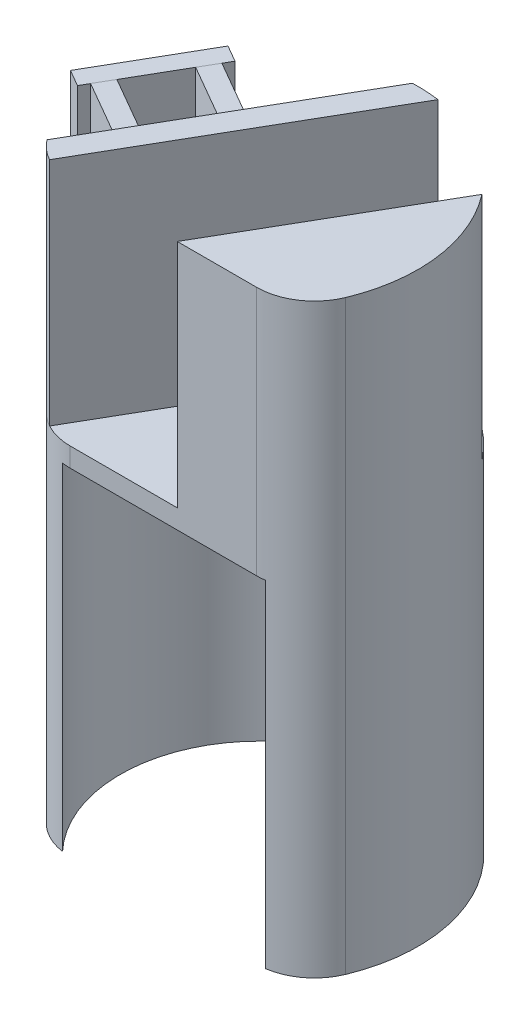
ISO-10303-21;
HEADER;
FILE_DESCRIPTION(('STEP AP214'),'2;1');
FILE_NAME('part.step','',(''),(''),'','','');
FILE_SCHEMA(('AUTOMOTIVE_DESIGN { 1 0 10303 214 1 1 1 1 }'));
ENDSEC;
DATA;
#1=APPLICATION_CONTEXT('core data for automotive mechanical design processes');
#2=APPLICATION_PROTOCOL_DEFINITION('international standard','automotive_design',2000,#1);
#3=PRODUCT_CONTEXT('',#1,'mechanical');
#4=PRODUCT('Part','Part','',(#3));
#5=PRODUCT_RELATED_PRODUCT_CATEGORY('part','',(#4));
#6=PRODUCT_DEFINITION_FORMATION('','',#4);
#7=PRODUCT_DEFINITION_CONTEXT('part definition',#1,'design');
#8=PRODUCT_DEFINITION('design','',#6,#7);
#9=PRODUCT_DEFINITION_SHAPE('','',#8);
#10=(LENGTH_UNIT() NAMED_UNIT(*) SI_UNIT(.MILLI.,.METRE.));
#11=(NAMED_UNIT(*) PLANE_ANGLE_UNIT() SI_UNIT($,.RADIAN.));
#12=(NAMED_UNIT(*) SI_UNIT($,.STERADIAN.) SOLID_ANGLE_UNIT());
#13=UNCERTAINTY_MEASURE_WITH_UNIT(LENGTH_MEASURE(1.E-05),#10,'distance_accuracy_value','');
#14=(GEOMETRIC_REPRESENTATION_CONTEXT(3) GLOBAL_UNCERTAINTY_ASSIGNED_CONTEXT((#13)) GLOBAL_UNIT_ASSIGNED_CONTEXT((#10,
#11,#12)) REPRESENTATION_CONTEXT('',''));
#15=CARTESIAN_POINT('',(0.,0.,0.));
#16=DIRECTION('',(0.,0.,1.));
#17=DIRECTION('',(1.,0.,0.));
#18=AXIS2_PLACEMENT_3D('',#15,#16,#17);
#19=CARTESIAN_POINT('',(-16.1590211270711,58.142616215477,-9.51175440733389));
#20=DIRECTION('',(0.500000000000004,0.,-0.866025403784436));
#21=DIRECTION('',(-0.866025403784436,0.,-0.500000000000004));
#22=AXIS2_PLACEMENT_3D('',#19,#20,#21);
#23=PLANE('',#22);
#24=DIRECTION('',(0.,1.,0.));
#25=VECTOR('',#24,1.);
#26=CARTESIAN_POINT('',(-12.4776684857521,0.,-7.38632446888636));
#27=LINE('',#26,#25);
#28=CARTESIAN_POINT('',(-12.4776684857521,35.,-7.38632446888637));
#29=VERTEX_POINT('',#28);
#30=CARTESIAN_POINT('',(-12.4776684857521,27.,-7.38632446888637));
#31=VERTEX_POINT('',#30);
#32=EDGE_CURVE('E118',#29,#31,#27,.F.);
#33=ORIENTED_EDGE('',*,*,#32,.F.);
#34=DIRECTION('',(-0.866025403784436,0.,-0.500000000000004));
#35=VECTOR('',#34,1.);
#36=CARTESIAN_POINT('',(-16.1590211270711,35.,-9.51175440733389));
#37=LINE('',#36,#35);
#38=CARTESIAN_POINT('',(-7.49876708922678,35.,-4.51175440733385));
#39=VERTEX_POINT('',#38);
#40=EDGE_CURVE('E107',#39,#29,#37,.T.);
#41=ORIENTED_EDGE('',*,*,#40,.F.);
#42=DIRECTION('',(0.,1.,0.));
#43=VECTOR('',#42,1.);
#44=CARTESIAN_POINT('',(-7.49876708922677,58.142616215477,-4.51175440733385));
#45=LINE('',#44,#43);
#46=CARTESIAN_POINT('',(-7.49876708922677,58.142616215477,-4.51175440733385));
#47=VERTEX_POINT('',#46);
#48=EDGE_CURVE('E125',#39,#47,#45,.T.);
#49=ORIENTED_EDGE('',*,*,#48,.T.);
#50=DIRECTION('',(0.866025403784436,0.,0.500000000000004));
#51=VECTOR('',#50,1.);
#52=CARTESIAN_POINT('',(-16.1590211270711,58.142616215477,-9.51175440733389));
#53=LINE('',#52,#51);
#54=CARTESIAN_POINT('',(-16.1590211270711,58.142616215477,-9.51175440733389));
#55=VERTEX_POINT('',#54);
#56=EDGE_CURVE('E146',#55,#47,#53,.T.);
#57=ORIENTED_EDGE('',*,*,#56,.F.);
#58=DIRECTION('',(0.,1.,0.));
#59=VECTOR('',#58,1.);
#60=CARTESIAN_POINT('',(-16.1590211270711,58.142616215477,-9.51175440733389));
#61=LINE('',#60,#59);
#62=CARTESIAN_POINT('',(-16.1590211270711,27.,-9.51175440733389));
#63=VERTEX_POINT('',#62);
#64=EDGE_CURVE('E130',#63,#55,#61,.T.);
#65=ORIENTED_EDGE('',*,*,#64,.F.);
#66=DIRECTION('',(0.866025403784436,0.,0.500000000000004));
#67=VECTOR('',#66,1.);
#68=CARTESIAN_POINT('',(-16.1590211270711,27.,-9.51175440733389));
#69=LINE('',#68,#67);
#70=EDGE_CURVE('E124',#63,#31,#69,.T.);
#71=ORIENTED_EDGE('',*,*,#70,.T.);
#72=EDGE_LOOP('',(#33,#41,#49,#57,#65,#71));
#73=FACE_BOUND('',#72,.T.);
#74=ADVANCED_FACE('F49',(#73),#23,.F.);
#75=CARTESIAN_POINT('',(-15.1590211270711,58.142616215477,-11.2438052149028));
#76=DIRECTION('',(-0.500000000000004,0.,0.866025403784436));
#77=DIRECTION('',(0.866025403784436,0.,0.500000000000004));
#78=AXIS2_PLACEMENT_3D('',#75,#76,#77);
#79=PLANE('',#78);
#80=DIRECTION('',(0.,1.,0.));
#81=VECTOR('',#80,1.);
#82=CARTESIAN_POINT('',(-11.3385754410158,0.,-9.03806986963436));
#83=LINE('',#82,#81);
#84=CARTESIAN_POINT('',(-11.3385754410158,27.,-9.03806986963436));
#85=VERTEX_POINT('',#84);
#86=CARTESIAN_POINT('',(-11.3385754410158,35.,-9.03806986963437));
#87=VERTEX_POINT('',#86);
#88=EDGE_CURVE('E114',#85,#87,#83,.T.);
#89=ORIENTED_EDGE('',*,*,#88,.F.);
#90=DIRECTION('',(0.866025403784436,0.,0.500000000000004));
#91=VECTOR('',#90,1.);
#92=CARTESIAN_POINT('',(-15.1590211270711,27.,-11.2438052149028));
#93=LINE('',#92,#91);
#94=CARTESIAN_POINT('',(-15.1590211270711,27.,-11.2438052149028));
#95=VERTEX_POINT('',#94);
#96=EDGE_CURVE('E141',#95,#85,#93,.T.);
#97=ORIENTED_EDGE('',*,*,#96,.F.);
#98=DIRECTION('',(0.,-1.,0.));
#99=VECTOR('',#98,1.);
#100=CARTESIAN_POINT('',(-15.1590211270711,58.142616215477,-11.2438052149028));
#101=LINE('',#100,#99);
#102=CARTESIAN_POINT('',(-15.1590211270711,58.142616215477,-11.2438052149028));
#103=VERTEX_POINT('',#102);
#104=EDGE_CURVE('E134',#103,#95,#101,.T.);
#105=ORIENTED_EDGE('',*,*,#104,.F.);
#106=DIRECTION('',(0.866025403784436,0.,0.500000000000004));
#107=VECTOR('',#106,1.);
#108=CARTESIAN_POINT('',(-15.1590211270711,58.142616215477,-11.2438052149028));
#109=LINE('',#108,#107);
#110=CARTESIAN_POINT('',(-6.49876708922677,58.142616215477,-6.24380521490272));
#111=VERTEX_POINT('',#110);
#112=EDGE_CURVE('E144',#103,#111,#109,.T.);
#113=ORIENTED_EDGE('',*,*,#112,.T.);
#114=DIRECTION('',(0.,-1.,0.));
#115=VECTOR('',#114,1.);
#116=CARTESIAN_POINT('',(-6.49876708922677,58.142616215477,-6.24380521490272));
#117=LINE('',#116,#115);
#118=CARTESIAN_POINT('',(-6.49876708922677,35.,-6.24380521490272));
#119=VERTEX_POINT('',#118);
#120=EDGE_CURVE('E132',#111,#119,#117,.T.);
#121=ORIENTED_EDGE('',*,*,#120,.T.);
#122=DIRECTION('',(0.866025403784436,0.,0.500000000000004));
#123=VECTOR('',#122,1.);
#124=CARTESIAN_POINT('',(-15.1590211270711,35.,-11.2438052149028));
#125=LINE('',#124,#123);
#126=EDGE_CURVE('E63',#87,#119,#125,.T.);
#127=ORIENTED_EDGE('',*,*,#126,.F.);
#128=EDGE_LOOP('',(#89,#97,#105,#113,#121,#127));
#129=FACE_BOUND('',#128,.T.);
#130=ADVANCED_FACE('F153',(#129),#79,.F.);
#131=CARTESIAN_POINT('',(-7.57772228311382,0.,-4.37500000000004));
#132=DIRECTION('',(-0.866025403784436,0.,-0.500000000000004));
#133=DIRECTION('',(-0.500000000000004,0.,0.866025403784436));
#134=AXIS2_PLACEMENT_3D('',#131,#132,#133);
#135=PLANE('',#134);
#136=DIRECTION('',(-0.500000000000004,0.,0.866025403784436));
#137=VECTOR('',#136,1.);
#138=CARTESIAN_POINT('',(-7.57772228311382,35.,-4.37500000000004));
#139=LINE('',#138,#137);
#140=EDGE_CURVE('E56',#119,#39,#139,.T.);
#141=ORIENTED_EDGE('',*,*,#140,.F.);
#142=ORIENTED_EDGE('',*,*,#120,.F.);
#143=DIRECTION('',(0.500000000000004,0.,-0.866025403784436));
#144=VECTOR('',#143,1.);
#145=CARTESIAN_POINT('',(-6.49876708922677,58.142616215477,-6.24380521490272));
#146=LINE('',#145,#144);
#147=EDGE_CURVE('E88',#47,#111,#146,.T.);
#148=ORIENTED_EDGE('',*,*,#147,.F.);
#149=ORIENTED_EDGE('',*,*,#48,.F.);
#150=EDGE_LOOP('',(#141,#142,#148,#149));
#151=FACE_BOUND('',#150,.T.);
#152=ADVANCED_FACE('F151',(#151),#135,.F.);
#153=CARTESIAN_POINT('',(-15.1590211270711,58.142616215477,-11.2438052149028));
#154=DIRECTION('',(0.,-1.,0.));
#155=DIRECTION('',(0.,0.,-1.));
#156=AXIS2_PLACEMENT_3D('',#153,#154,#155);
#157=PLANE('',#156);
#158=ORIENTED_EDGE('',*,*,#147,.T.);
#159=ORIENTED_EDGE('',*,*,#112,.F.);
#160=DIRECTION('',(0.500000000000004,0.,-0.866025403784436));
#161=VECTOR('',#160,1.);
#162=CARTESIAN_POINT('',(-15.1590211270711,58.142616215477,-11.2438052149028));
#163=LINE('',#162,#161);
#164=EDGE_CURVE('E93',#55,#103,#163,.T.);
#165=ORIENTED_EDGE('',*,*,#164,.F.);
#166=ORIENTED_EDGE('',*,*,#56,.T.);
#167=EDGE_LOOP('',(#158,#159,#165,#166));
#168=FACE_BOUND('',#167,.T.);
#169=ADVANCED_FACE('F148',(#168),#157,.F.);
#170=CARTESIAN_POINT('',(-15.1590211270711,27.,-11.2438052149028));
#171=DIRECTION('',(0.,1.,0.));
#172=DIRECTION('',(0.,0.,1.));
#173=AXIS2_PLACEMENT_3D('',#170,#171,#172);
#174=PLANE('',#173);
#175=CARTESIAN_POINT('',(0.,27.,0.));
#176=DIRECTION('',(0.,1.,0.));
#177=DIRECTION('',(0.,0.,1.));
#178=AXIS2_PLACEMENT_3D('',#175,#176,#177);
#179=CIRCLE('',#178,14.5);
#180=EDGE_CURVE('E12',#31,#85,#179,.F.);
#181=ORIENTED_EDGE('',*,*,#180,.F.);
#182=ORIENTED_EDGE('',*,*,#70,.F.);
#183=DIRECTION('',(-0.500000000000004,0.,0.866025403784436));
#184=VECTOR('',#183,1.);
#185=CARTESIAN_POINT('',(-15.1590211270711,27.,-11.2438052149028));
#186=LINE('',#185,#184);
#187=EDGE_CURVE('E72',#95,#63,#186,.T.);
#188=ORIENTED_EDGE('',*,*,#187,.F.);
#189=ORIENTED_EDGE('',*,*,#96,.T.);
#190=EDGE_LOOP('',(#181,#182,#188,#189));
#191=FACE_BOUND('',#190,.T.);
#192=ADVANCED_FACE('F158',(#191),#174,.F.);
#193=CARTESIAN_POINT('',(-16.2379763209582,0.,-9.37500000000008));
#194=DIRECTION('',(-0.866025403784436,0.,-0.500000000000004));
#195=DIRECTION('',(-0.500000000000004,0.,0.866025403784436));
#196=AXIS2_PLACEMENT_3D('',#193,#194,#195);
#197=PLANE('',#196);
#198=ORIENTED_EDGE('',*,*,#64,.T.);
#199=ORIENTED_EDGE('',*,*,#164,.T.);
#200=ORIENTED_EDGE('',*,*,#104,.T.);
#201=ORIENTED_EDGE('',*,*,#187,.T.);
#202=EDGE_LOOP('',(#198,#199,#200,#201));
#203=FACE_BOUND('',#202,.T.);
#204=ADVANCED_FACE('F156',(#203),#197,.T.);
#205=CARTESIAN_POINT('',(0.,0.,0.));
#206=DIRECTION('',(0.,1.,0.));
#207=DIRECTION('',(0.,0.,1.));
#208=AXIS2_PLACEMENT_3D('',#205,#206,#207);
#209=CYLINDRICAL_SURFACE('',#208,14.5);
#210=ORIENTED_EDGE('',*,*,#32,.T.);
#211=ORIENTED_EDGE('',*,*,#180,.T.);
#212=ORIENTED_EDGE('',*,*,#88,.T.);
#213=CARTESIAN_POINT('',(0.,35.,0.));
#214=DIRECTION('',(0.,-1.,0.));
#215=DIRECTION('',(0.,0.,-1.));
#216=AXIS2_PLACEMENT_3D('',#213,#214,#215);
#217=CIRCLE('',#216,14.5);
#218=EDGE_CURVE('E110',#29,#87,#217,.T.);
#219=ORIENTED_EDGE('',*,*,#218,.F.);
#220=EDGE_LOOP('',(#210,#211,#212,#219));
#221=FACE_BOUND('',#220,.T.);
#222=ADVANCED_FACE('F117',(#221),#209,.F.);
#223=CARTESIAN_POINT('',(9.7082439194738,35.,4.));
#224=DIRECTION('',(0.,-1.,0.));
#225=DIRECTION('',(0.,0.,-1.));
#226=AXIS2_PLACEMENT_3D('',#223,#224,#225);
#227=PLANE('',#226);
#228=ORIENTED_EDGE('',*,*,#40,.T.);
#229=ORIENTED_EDGE('',*,*,#218,.T.);
#230=ORIENTED_EDGE('',*,*,#126,.T.);
#231=ORIENTED_EDGE('',*,*,#140,.T.);
#232=EDGE_LOOP('',(#228,#229,#230,#231));
#233=FACE_BOUND('',#232,.T.);
#234=ADVANCED_FACE('F109',(#233),#227,.T.);
#235=CLOSED_SHELL('',(#74,#130,#152,#169,#192,#204,#222,#234));
#236=MANIFOLD_SOLID_BREP('B2',#235);
#237=CARTESIAN_POINT('',(-20.1590211270712,58.142616215477,-2.5835511770584));
#238=DIRECTION('',(0.500000000000004,0.,-0.866025403784436));
#239=DIRECTION('',(-0.866025403784436,0.,-0.500000000000004));
#240=AXIS2_PLACEMENT_3D('',#237,#238,#239);
#241=PLANE('',#240);
#242=DIRECTION('',(0.,1.,0.));
#243=VECTOR('',#242,1.);
#244=CARTESIAN_POINT('',(-14.4834177821711,0.,0.693259941933222));
#245=LINE('',#244,#243);
#246=CARTESIAN_POINT('',(-14.4834177821711,35.,0.693259941933225));
#247=VERTEX_POINT('',#246);
#248=CARTESIAN_POINT('',(-14.4834177821711,27.,0.693259941933221));
#249=VERTEX_POINT('',#248);
#250=EDGE_CURVE('E327',#247,#249,#245,.F.);
#251=ORIENTED_EDGE('',*,*,#250,.F.);
#252=DIRECTION('',(-0.866025403784436,0.,-0.500000000000004));
#253=VECTOR('',#252,1.);
#254=CARTESIAN_POINT('',(-20.1590211270712,35.,-2.5835511770584));
#255=LINE('',#254,#253);
#256=CARTESIAN_POINT('',(-11.4987670892268,35.,2.41644882294164));
#257=VERTEX_POINT('',#256);
#258=EDGE_CURVE('E316',#257,#247,#255,.T.);
#259=ORIENTED_EDGE('',*,*,#258,.F.);
#260=DIRECTION('',(0.,1.,0.));
#261=VECTOR('',#260,1.);
#262=CARTESIAN_POINT('',(-11.4987670892268,58.142616215477,2.41644882294164));
#263=LINE('',#262,#261);
#264=CARTESIAN_POINT('',(-11.4987670892268,58.142616215477,2.41644882294164));
#265=VERTEX_POINT('',#264);
#266=EDGE_CURVE('E366',#257,#265,#263,.T.);
#267=ORIENTED_EDGE('',*,*,#266,.T.);
#268=DIRECTION('',(0.866025403784436,0.,0.500000000000004));
#269=VECTOR('',#268,1.);
#270=CARTESIAN_POINT('',(-20.1590211270712,58.142616215477,-2.5835511770584));
#271=LINE('',#270,#269);
#272=CARTESIAN_POINT('',(-20.1590211270712,58.142616215477,-2.5835511770584));
#273=VERTEX_POINT('',#272);
#274=EDGE_CURVE('E391',#273,#265,#271,.T.);
#275=ORIENTED_EDGE('',*,*,#274,.F.);
#276=DIRECTION('',(0.,1.,0.));
#277=VECTOR('',#276,1.);
#278=CARTESIAN_POINT('',(-20.1590211270712,58.142616215477,-2.5835511770584));
#279=LINE('',#278,#277);
#280=CARTESIAN_POINT('',(-20.1590211270712,58.1383875561259,-2.5835511770584));
#281=VERTEX_POINT('',#280);
#282=EDGE_CURVE('E370',#281,#273,#279,.T.);
#283=ORIENTED_EDGE('',*,*,#282,.F.);
#284=CARTESIAN_POINT('',(-20.1590211270712,27.,-2.58355117705839));
#285=VERTEX_POINT('',#284);
#286=EDGE_CURVE('E367',#285,#281,#279,.T.);
#287=ORIENTED_EDGE('',*,*,#286,.F.);
#288=DIRECTION('',(0.866025403784436,0.,0.500000000000004));
#289=VECTOR('',#288,1.);
#290=CARTESIAN_POINT('',(-20.1590211270712,27.,-2.5835511770584));
#291=LINE('',#290,#289);
#292=EDGE_CURVE('E334',#285,#249,#291,.T.);
#293=ORIENTED_EDGE('',*,*,#292,.T.);
#294=EDGE_LOOP('',(#251,#259,#267,#275,#283,#287,#293));
#295=FACE_BOUND('',#294,.T.);
#296=ADVANCED_FACE('F234',(#295),#241,.F.);
#297=CARTESIAN_POINT('',(-19.1590211270712,58.142616215477,-4.31560198462727));
#298=DIRECTION('',(-0.500000000000004,0.,0.866025403784436));
#299=DIRECTION('',(0.866025403784436,0.,0.500000000000004));
#300=AXIS2_PLACEMENT_3D('',#297,#298,#299);
#301=PLANE('',#300);
#302=DIRECTION('',(0.,1.,0.));
#303=VECTOR('',#302,1.);
#304=CARTESIAN_POINT('',(-14.414085818919,0.,-1.57611230717822));
#305=LINE('',#304,#303);
#306=CARTESIAN_POINT('',(-14.414085818919,27.,-1.57611230717822));
#307=VERTEX_POINT('',#306);
#308=CARTESIAN_POINT('',(-14.414085818919,35.,-1.57611230717822));
#309=VERTEX_POINT('',#308);
#310=EDGE_CURVE('E323',#307,#309,#305,.T.);
#311=ORIENTED_EDGE('',*,*,#310,.F.);
#312=DIRECTION('',(0.866025403784436,0.,0.500000000000004));
#313=VECTOR('',#312,1.);
#314=CARTESIAN_POINT('',(-19.1590211270712,27.,-4.31560198462727));
#315=LINE('',#314,#313);
#316=CARTESIAN_POINT('',(-19.1590211270712,27.,-4.31560198462727));
#317=VERTEX_POINT('',#316);
#318=EDGE_CURVE('E385',#317,#307,#315,.T.);
#319=ORIENTED_EDGE('',*,*,#318,.F.);
#320=DIRECTION('',(0.,-1.,0.));
#321=VECTOR('',#320,1.);
#322=CARTESIAN_POINT('',(-19.1590211270712,58.142616215477,-4.31560198462727));
#323=LINE('',#322,#321);
#324=CARTESIAN_POINT('',(-19.1590211270712,58.1391564032806,-4.31560198462727));
#325=VERTEX_POINT('',#324);
#326=EDGE_CURVE('E372',#325,#317,#323,.T.);
#327=ORIENTED_EDGE('',*,*,#326,.F.);
#328=CARTESIAN_POINT('',(-19.1590211270712,58.142616215477,-4.31560198462727));
#329=VERTEX_POINT('',#328);
#330=EDGE_CURVE('E373',#329,#325,#323,.T.);
#331=ORIENTED_EDGE('',*,*,#330,.F.);
#332=DIRECTION('',(0.866025403784436,0.,0.500000000000004));
#333=VECTOR('',#332,1.);
#334=CARTESIAN_POINT('',(-19.1590211270712,58.142616215477,-4.31560198462727));
#335=LINE('',#334,#333);
#336=CARTESIAN_POINT('',(-10.4987670892268,58.142616215477,0.684398015372769));
#337=VERTEX_POINT('',#336);
#338=EDGE_CURVE('E388',#329,#337,#335,.T.);
#339=ORIENTED_EDGE('',*,*,#338,.T.);
#340=DIRECTION('',(0.,-1.,0.));
#341=VECTOR('',#340,1.);
#342=CARTESIAN_POINT('',(-10.4987670892268,58.142616215477,0.684398015372769));
#343=LINE('',#342,#341);
#344=CARTESIAN_POINT('',(-10.4987670892268,35.,0.684398015372771));
#345=VERTEX_POINT('',#344);
#346=EDGE_CURVE('E381',#337,#345,#343,.T.);
#347=ORIENTED_EDGE('',*,*,#346,.T.);
#348=DIRECTION('',(0.866025403784436,0.,0.500000000000004));
#349=VECTOR('',#348,1.);
#350=CARTESIAN_POINT('',(-19.1590211270712,35.,-4.31560198462727));
#351=LINE('',#350,#349);
#352=EDGE_CURVE('E248',#309,#345,#351,.T.);
#353=ORIENTED_EDGE('',*,*,#352,.F.);
#354=EDGE_LOOP('',(#311,#319,#327,#331,#339,#347,#353));
#355=FACE_BOUND('',#354,.T.);
#356=ADVANCED_FACE('F409',(#355),#301,.F.);
#357=CARTESIAN_POINT('',(-7.57772228311382,0.,-4.37500000000004));
#358=DIRECTION('',(-0.866025403784436,0.,-0.500000000000004));
#359=DIRECTION('',(-0.500000000000004,0.,0.866025403784436));
#360=AXIS2_PLACEMENT_3D('',#357,#358,#359);
#361=PLANE('',#360);
#362=DIRECTION('',(-0.500000000000004,0.,0.866025403784436));
#363=VECTOR('',#362,1.);
#364=CARTESIAN_POINT('',(-7.57772228311382,35.,-4.37500000000004));
#365=LINE('',#364,#363);
#366=EDGE_CURVE('E241',#345,#257,#365,.T.);
#367=ORIENTED_EDGE('',*,*,#366,.F.);
#368=ORIENTED_EDGE('',*,*,#346,.F.);
#369=DIRECTION('',(0.500000000000004,0.,-0.866025403784436));
#370=VECTOR('',#369,1.);
#371=CARTESIAN_POINT('',(-10.4987670892268,58.142616215477,0.684398015372769));
#372=LINE('',#371,#370);
#373=EDGE_CURVE('E379',#265,#337,#372,.T.);
#374=ORIENTED_EDGE('',*,*,#373,.F.);
#375=ORIENTED_EDGE('',*,*,#266,.F.);
#376=EDGE_LOOP('',(#367,#368,#374,#375));
#377=FACE_BOUND('',#376,.T.);
#378=ADVANCED_FACE('F446',(#377),#361,.F.);
#379=CARTESIAN_POINT('',(-16.2379763209582,0.,-9.37500000000008));
#380=DIRECTION('',(-0.866025403784436,0.,-0.500000000000004));
#381=DIRECTION('',(-0.500000000000004,0.,0.866025403784436));
#382=AXIS2_PLACEMENT_3D('',#379,#380,#381);
#383=PLANE('',#382);
#384=ORIENTED_EDGE('',*,*,#330,.T.);
#385=DIRECTION('',(-0.499999963054636,-0.000384423548971222,0.866025339793183));
#386=VECTOR('',#385,1.);
#387=CARTESIAN_POINT('',(-16.2491517822281,58.1413936480471,-9.35564353328256));
#388=LINE('',#387,#386);
#389=EDGE_CURVE('E394',#325,#281,#388,.T.);
#390=ORIENTED_EDGE('',*,*,#389,.T.);
#391=ORIENTED_EDGE('',*,*,#282,.T.);
#392=DIRECTION('',(0.500000000000004,0.,-0.866025403784436));
#393=VECTOR('',#392,1.);
#394=CARTESIAN_POINT('',(-19.1590211270712,58.142616215477,-4.31560198462727));
#395=LINE('',#394,#393);
#396=EDGE_CURVE('E369',#273,#329,#395,.T.);
#397=ORIENTED_EDGE('',*,*,#396,.T.);
#398=EDGE_LOOP('',(#384,#390,#391,#397));
#399=FACE_BOUND('',#398,.T.);
#400=ADVANCED_FACE('F398',(#399),#383,.T.);
#401=CARTESIAN_POINT('',(-19.1590211270712,58.142616215477,-4.31560198462727));
#402=DIRECTION('',(0.,-1.,0.));
#403=DIRECTION('',(0.,0.,-1.));
#404=AXIS2_PLACEMENT_3D('',#401,#402,#403);
#405=PLANE('',#404);
#406=ORIENTED_EDGE('',*,*,#373,.T.);
#407=ORIENTED_EDGE('',*,*,#338,.F.);
#408=ORIENTED_EDGE('',*,*,#396,.F.);
#409=ORIENTED_EDGE('',*,*,#274,.T.);
#410=EDGE_LOOP('',(#406,#407,#408,#409));
#411=FACE_BOUND('',#410,.T.);
#412=ADVANCED_FACE('F405',(#411),#405,.F.);
#413=CARTESIAN_POINT('',(-19.1590211270712,27.,-4.31560198462727));
#414=DIRECTION('',(0.,1.,0.));
#415=DIRECTION('',(0.,0.,1.));
#416=AXIS2_PLACEMENT_3D('',#413,#414,#415);
#417=PLANE('',#416);
#418=CARTESIAN_POINT('',(0.,27.,0.));
#419=DIRECTION('',(0.,1.,0.));
#420=DIRECTION('',(0.,0.,1.));
#421=AXIS2_PLACEMENT_3D('',#418,#419,#420);
#422=CIRCLE('',#421,14.5);
#423=EDGE_CURVE('E47',#249,#307,#422,.F.);
#424=ORIENTED_EDGE('',*,*,#423,.F.);
#425=ORIENTED_EDGE('',*,*,#292,.F.);
#426=DIRECTION('',(-0.500000000000004,0.,0.866025403784436));
#427=VECTOR('',#426,1.);
#428=CARTESIAN_POINT('',(-19.1590211270712,27.,-4.31560198462727));
#429=LINE('',#428,#427);
#430=EDGE_CURVE('E376',#317,#285,#429,.T.);
#431=ORIENTED_EDGE('',*,*,#430,.F.);
#432=ORIENTED_EDGE('',*,*,#318,.T.);
#433=EDGE_LOOP('',(#424,#425,#431,#432));
#434=FACE_BOUND('',#433,.T.);
#435=ADVANCED_FACE('F454',(#434),#417,.F.);
#436=CARTESIAN_POINT('',(-16.2379763209582,0.,-9.37500000000008));
#437=DIRECTION('',(0.866025403784436,0.,0.500000000000004));
#438=DIRECTION('',(0.500000000000004,0.,-0.866025403784436));
#439=AXIS2_PLACEMENT_3D('',#436,#437,#438);
#440=PLANE('',#439);
#441=ORIENTED_EDGE('',*,*,#286,.T.);
#442=DIRECTION('',(0.499999963054637,0.000384423548971222,-0.866025339793183));
#443=VECTOR('',#442,1.);
#444=CARTESIAN_POINT('',(-14.6590211270711,58.142616215477,-12.1098306186872));
#445=LINE('',#444,#443);
#446=CARTESIAN_POINT('',(-20.6590211270712,58.1380031325485,-1.71752577327397));
#447=VERTEX_POINT('',#446);
#448=EDGE_CURVE('E256',#447,#281,#445,.T.);
#449=ORIENTED_EDGE('',*,*,#448,.F.);
#450=DIRECTION('',(0.,1.,0.));
#451=VECTOR('',#450,1.);
#452=CARTESIAN_POINT('',(-20.6590211270712,58.1380031325485,-1.71752577327397));
#453=LINE('',#452,#451);
#454=CARTESIAN_POINT('',(-20.6590211270712,26.9953869170715,-1.71752577327397));
#455=VERTEX_POINT('',#454);
#456=EDGE_CURVE('E344',#455,#447,#453,.T.);
#457=ORIENTED_EDGE('',*,*,#456,.F.);
#458=DIRECTION('',(-0.499999963054637,-0.000384423548971222,0.866025339793182));
#459=VECTOR('',#458,1.);
#460=CARTESIAN_POINT('',(-14.6590211270711,27.,-12.1098306186872));
#461=LINE('',#460,#459);
#462=CARTESIAN_POINT('',(-14.6590211270711,27.,-12.1098306186872));
#463=VERTEX_POINT('',#462);
#464=EDGE_CURVE('E353',#463,#455,#461,.T.);
#465=ORIENTED_EDGE('',*,*,#464,.F.);
#466=DIRECTION('',(0.,-1.,0.));
#467=VECTOR('',#466,1.);
#468=CARTESIAN_POINT('',(-14.6590211270711,58.142616215477,-12.1098306186872));
#469=LINE('',#468,#467);
#470=CARTESIAN_POINT('',(-14.6590211270711,58.142616215477,-12.1098306186872));
#471=VERTEX_POINT('',#470);
#472=EDGE_CURVE('E351',#471,#463,#469,.T.);
#473=ORIENTED_EDGE('',*,*,#472,.F.);
#474=EDGE_CURVE('E335',#325,#471,#445,.T.);
#475=ORIENTED_EDGE('',*,*,#474,.F.);
#476=ORIENTED_EDGE('',*,*,#326,.T.);
#477=ORIENTED_EDGE('',*,*,#430,.T.);
#478=EDGE_LOOP('',(#441,#449,#457,#465,#473,#475,#476,#477));
#479=FACE_BOUND('',#478,.T.);
#480=ADVANCED_FACE('F413',(#479),#440,.T.);
#481=CARTESIAN_POINT('',(-16.39107193464,58.142616215477,-13.1098306186872));
#482=DIRECTION('',(0.000192211774485619,-0.999999926109265,-0.000332920559222045));
#483=DIRECTION('',(0.,0.000332920565371981,-0.999999944581947));
#484=AXIS2_PLACEMENT_3D('',#481,#482,#483);
#485=PLANE('',#484);
#486=ORIENTED_EDGE('',*,*,#448,.T.);
#487=ORIENTED_EDGE('',*,*,#389,.F.);
#488=ORIENTED_EDGE('',*,*,#474,.T.);
#489=DIRECTION('',(0.866025403784436,0.,0.500000000000004));
#490=VECTOR('',#489,1.);
#491=CARTESIAN_POINT('',(-16.39107193464,58.142616215477,-13.1098306186872));
#492=LINE('',#491,#490);
#493=CARTESIAN_POINT('',(-16.39107193464,58.142616215477,-13.1098306186872));
#494=VERTEX_POINT('',#493);
#495=EDGE_CURVE('E363',#494,#471,#492,.T.);
#496=ORIENTED_EDGE('',*,*,#495,.F.);
#497=DIRECTION('',(0.499999963054637,0.000384423548971222,-0.866025339793183));
#498=VECTOR('',#497,1.);
#499=CARTESIAN_POINT('',(-16.39107193464,58.142616215477,-13.1098306186872));
#500=LINE('',#499,#498);
#501=CARTESIAN_POINT('',(-22.3910719346401,58.1380031325485,-2.71752577327398));
#502=VERTEX_POINT('',#501);
#503=EDGE_CURVE('E340',#502,#494,#500,.T.);
#504=ORIENTED_EDGE('',*,*,#503,.F.);
#505=DIRECTION('',(0.866025403784436,0.,0.500000000000004));
#506=VECTOR('',#505,1.);
#507=CARTESIAN_POINT('',(-22.3910719346401,58.1380031325485,-2.71752577327398));
#508=LINE('',#507,#506);
#509=EDGE_CURVE('E349',#502,#447,#508,.T.);
#510=ORIENTED_EDGE('',*,*,#509,.T.);
#511=EDGE_LOOP('',(#486,#487,#488,#496,#504,#510));
#512=FACE_BOUND('',#511,.T.);
#513=ADVANCED_FACE('F417',(#512),#485,.F.);
#514=CARTESIAN_POINT('',(-16.39107193464,58.142616215477,-13.1098306186872));
#515=DIRECTION('',(-0.500000000000004,0.,0.866025403784436));
#516=DIRECTION('',(0.866025403784436,0.,0.500000000000004));
#517=AXIS2_PLACEMENT_3D('',#514,#515,#516);
#518=PLANE('',#517);
#519=ORIENTED_EDGE('',*,*,#472,.T.);
#520=DIRECTION('',(0.866025403784436,0.,0.500000000000004));
#521=VECTOR('',#520,1.);
#522=CARTESIAN_POINT('',(-16.39107193464,27.,-13.1098306186872));
#523=LINE('',#522,#521);
#524=CARTESIAN_POINT('',(-16.39107193464,27.,-13.1098306186872));
#525=VERTEX_POINT('',#524);
#526=EDGE_CURVE('E360',#525,#463,#523,.T.);
#527=ORIENTED_EDGE('',*,*,#526,.F.);
#528=DIRECTION('',(0.,-1.,0.));
#529=VECTOR('',#528,1.);
#530=CARTESIAN_POINT('',(-16.39107193464,58.142616215477,-13.1098306186872));
#531=LINE('',#530,#529);
#532=EDGE_CURVE('E343',#494,#525,#531,.T.);
#533=ORIENTED_EDGE('',*,*,#532,.F.);
#534=ORIENTED_EDGE('',*,*,#495,.T.);
#535=EDGE_LOOP('',(#519,#527,#533,#534));
#536=FACE_BOUND('',#535,.T.);
#537=ADVANCED_FACE('F420',(#536),#518,.F.);
#538=CARTESIAN_POINT('',(-16.39107193464,27.,-13.1098306186872));
#539=DIRECTION('',(-0.000192211774485619,0.999999926109265,0.000332920559222045));
#540=DIRECTION('',(0.,-0.000332920565371981,0.999999944581947));
#541=AXIS2_PLACEMENT_3D('',#538,#539,#540);
#542=PLANE('',#541);
#543=ORIENTED_EDGE('',*,*,#464,.T.);
#544=DIRECTION('',(0.866025403784436,0.,0.500000000000004));
#545=VECTOR('',#544,1.);
#546=CARTESIAN_POINT('',(-22.3910719346401,26.9953869170715,-2.71752577327397));
#547=LINE('',#546,#545);
#548=CARTESIAN_POINT('',(-22.3910719346401,26.9953869170715,-2.71752577327397));
#549=VERTEX_POINT('',#548);
#550=EDGE_CURVE('E357',#549,#455,#547,.T.);
#551=ORIENTED_EDGE('',*,*,#550,.F.);
#552=DIRECTION('',(-0.499999963054637,-0.000384423548971222,0.866025339793182));
#553=VECTOR('',#552,1.);
#554=CARTESIAN_POINT('',(-16.39107193464,27.,-13.1098306186872));
#555=LINE('',#554,#553);
#556=EDGE_CURVE('E346',#525,#549,#555,.T.);
#557=ORIENTED_EDGE('',*,*,#556,.F.);
#558=ORIENTED_EDGE('',*,*,#526,.T.);
#559=EDGE_LOOP('',(#543,#551,#557,#558));
#560=FACE_BOUND('',#559,.T.);
#561=ADVANCED_FACE('F432',(#560),#542,.F.);
#562=CARTESIAN_POINT('',(-22.3910719346401,58.1380031325485,-2.71752577327398));
#563=DIRECTION('',(0.500000000000004,0.,-0.866025403784436));
#564=DIRECTION('',(-0.866025403784436,0.,-0.500000000000004));
#565=AXIS2_PLACEMENT_3D('',#562,#563,#564);
#566=PLANE('',#565);
#567=ORIENTED_EDGE('',*,*,#456,.T.);
#568=ORIENTED_EDGE('',*,*,#509,.F.);
#569=DIRECTION('',(0.,1.,0.));
#570=VECTOR('',#569,1.);
#571=CARTESIAN_POINT('',(-22.3910719346401,58.1380031325485,-2.71752577327398));
#572=LINE('',#571,#570);
#573=EDGE_CURVE('E348',#549,#502,#572,.T.);
#574=ORIENTED_EDGE('',*,*,#573,.F.);
#575=ORIENTED_EDGE('',*,*,#550,.T.);
#576=EDGE_LOOP('',(#567,#568,#574,#575));
#577=FACE_BOUND('',#576,.T.);
#578=ADVANCED_FACE('F429',(#577),#566,.F.);
#579=CARTESIAN_POINT('',(-17.9700271285271,0.,-10.3750000000001));
#580=DIRECTION('',(0.866025403784436,0.,0.500000000000004));
#581=DIRECTION('',(0.500000000000004,0.,-0.866025403784436));
#582=AXIS2_PLACEMENT_3D('',#579,#580,#581);
#583=PLANE('',#582);
#584=ORIENTED_EDGE('',*,*,#503,.T.);
#585=ORIENTED_EDGE('',*,*,#532,.T.);
#586=ORIENTED_EDGE('',*,*,#556,.T.);
#587=ORIENTED_EDGE('',*,*,#573,.T.);
#588=EDGE_LOOP('',(#584,#585,#586,#587));
#589=FACE_BOUND('',#588,.T.);
#590=ADVANCED_FACE('F424',(#589),#583,.F.);
#591=CARTESIAN_POINT('',(0.,0.,0.));
#592=DIRECTION('',(0.,1.,0.));
#593=DIRECTION('',(0.,0.,1.));
#594=AXIS2_PLACEMENT_3D('',#591,#592,#593);
#595=CYLINDRICAL_SURFACE('',#594,14.5);
#596=ORIENTED_EDGE('',*,*,#250,.T.);
#597=ORIENTED_EDGE('',*,*,#423,.T.);
#598=ORIENTED_EDGE('',*,*,#310,.T.);
#599=CARTESIAN_POINT('',(0.,35.,0.));
#600=DIRECTION('',(0.,-1.,0.));
#601=DIRECTION('',(0.,0.,-1.));
#602=AXIS2_PLACEMENT_3D('',#599,#600,#601);
#603=CIRCLE('',#602,14.5);
#604=EDGE_CURVE('E319',#247,#309,#603,.T.);
#605=ORIENTED_EDGE('',*,*,#604,.F.);
#606=EDGE_LOOP('',(#596,#597,#598,#605));
#607=FACE_BOUND('',#606,.T.);
#608=ADVANCED_FACE('F326',(#607),#595,.F.);
#609=CARTESIAN_POINT('',(9.7082439194738,35.,4.));
#610=DIRECTION('',(0.,-1.,0.));
#611=DIRECTION('',(0.,0.,-1.));
#612=AXIS2_PLACEMENT_3D('',#609,#610,#611);
#613=PLANE('',#612);
#614=ORIENTED_EDGE('',*,*,#258,.T.);
#615=ORIENTED_EDGE('',*,*,#604,.T.);
#616=ORIENTED_EDGE('',*,*,#352,.T.);
#617=ORIENTED_EDGE('',*,*,#366,.T.);
#618=EDGE_LOOP('',(#614,#615,#616,#617));
#619=FACE_BOUND('',#618,.T.);
#620=ADVANCED_FACE('F318',(#619),#613,.T.);
#621=CLOSED_SHELL('',(#296,#356,#378,#400,#412,#435,#480,#513,#537,#561,#578,#590,#608,#620));
#622=MANIFOLD_SOLID_BREP('B6',#621);
#623=CARTESIAN_POINT('',(0.,61.,0.));
#624=DIRECTION('',(0.,-1.,0.));
#625=DIRECTION('',(0.,0.,-1.));
#626=AXIS2_PLACEMENT_3D('',#623,#624,#625);
#627=CYLINDRICAL_SURFACE('',#626,16.5);
#628=CARTESIAN_POINT('',(0.,37.,0.));
#629=DIRECTION('',(0.,1.,0.));
#630=DIRECTION('',(0.,0.,1.));
#631=AXIS2_PLACEMENT_3D('',#628,#629,#630);
#632=CIRCLE('',#631,16.5);
#633=CARTESIAN_POINT('',(2.22258025338506,37.,-16.3496219227621));
#634=VERTEX_POINT('',#633);
#635=CARTESIAN_POINT('',(-0.583304866344873,37.,-16.4896863351884));
#636=VERTEX_POINT('',#635);
#637=EDGE_CURVE('E622',#634,#636,#632,.T.);
#638=ORIENTED_EDGE('',*,*,#637,.T.);
#639=DIRECTION('',(0.,-1.,0.));
#640=VECTOR('',#639,1.);
#641=CARTESIAN_POINT('',(-0.583304866344873,61.,-16.4896863351884));
#642=LINE('',#641,#640);
#643=CARTESIAN_POINT('',(-0.583304866344873,61.,-16.4896863351884));
#644=VERTEX_POINT('',#643);
#645=EDGE_CURVE('E232',#644,#636,#642,.T.);
#646=ORIENTED_EDGE('',*,*,#645,.F.);
#647=CARTESIAN_POINT('',(0.,61.,0.));
#648=DIRECTION('',(0.,1.,0.));
#649=DIRECTION('',(0.,0.,1.));
#650=AXIS2_PLACEMENT_3D('',#647,#648,#649);
#651=CIRCLE('',#650,16.5);
#652=CARTESIAN_POINT('',(2.22258025338506,61.,-16.3496219227621));
#653=VERTEX_POINT('',#652);
#654=EDGE_CURVE('E610',#653,#644,#651,.T.);
#655=ORIENTED_EDGE('',*,*,#654,.F.);
#656=DIRECTION('',(0.,-1.,0.));
#657=VECTOR('',#656,1.);
#658=CARTESIAN_POINT('',(2.22258025338506,61.,-16.3496219227621));
#659=LINE('',#658,#657);
#660=EDGE_CURVE('E618',#653,#634,#659,.T.);
#661=ORIENTED_EDGE('',*,*,#660,.T.);
#662=EDGE_LOOP('',(#638,#646,#655,#661));
#663=FACE_BOUND('',#662,.T.);
#664=ADVANCED_FACE('F559',(#663),#627,.T.);
#665=CARTESIAN_POINT('',(-0.583304866344873,61.,-16.4896863351884));
#666=DIRECTION('',(0.866025403784436,0.,0.500000000000004));
#667=DIRECTION('',(0.500000000000004,0.,-0.866025403784436));
#668=AXIS2_PLACEMENT_3D('',#665,#666,#667);
#669=PLANE('',#668);
#670=DIRECTION('',(-0.500000000000004,0.,0.866025403784436));
#671=VECTOR('',#670,1.);
#672=CARTESIAN_POINT('',(-0.583304866344873,37.,-16.4896863351884));
#673=LINE('',#672,#671);
#674=CARTESIAN_POINT('',(-14.4987670892268,37.,7.61260124564826));
#675=VERTEX_POINT('',#674);
#676=EDGE_CURVE('E614',#636,#675,#673,.T.);
#677=ORIENTED_EDGE('',*,*,#676,.T.);
#678=DIRECTION('',(0.,-1.,0.));
#679=VECTOR('',#678,1.);
#680=CARTESIAN_POINT('',(-14.4987670892268,61.,7.61260124564826));
#681=LINE('',#680,#679);
#682=CARTESIAN_POINT('',(-14.4987670892268,61.,7.61260124564826));
#683=VERTEX_POINT('',#682);
#684=EDGE_CURVE('E567',#683,#675,#681,.T.);
#685=ORIENTED_EDGE('',*,*,#684,.F.);
#686=DIRECTION('',(-0.500000000000004,0.,0.866025403784436));
#687=VECTOR('',#686,1.);
#688=CARTESIAN_POINT('',(-0.583304866344873,61.,-16.4896863351884));
#689=LINE('',#688,#687);
#690=EDGE_CURVE('E605',#644,#683,#689,.T.);
#691=ORIENTED_EDGE('',*,*,#690,.F.);
#692=ORIENTED_EDGE('',*,*,#645,.T.);
#693=EDGE_LOOP('',(#677,#685,#691,#692));
#694=FACE_BOUND('',#693,.T.);
#695=ADVANCED_FACE('F613',(#694),#669,.F.);
#696=CARTESIAN_POINT('',(-9.7082439194738,61.,4.));
#697=DIRECTION('',(0.,-1.,0.));
#698=DIRECTION('',(0.,0.,-1.));
#699=AXIS2_PLACEMENT_3D('',#696,#697,#698);
#700=CYLINDRICAL_SURFACE('',#699,6.);
#701=CARTESIAN_POINT('',(-9.7082439194738,37.,4.));
#702=DIRECTION('',(0.,1.,0.));
#703=DIRECTION('',(0.,0.,1.));
#704=AXIS2_PLACEMENT_3D('',#701,#702,#703);
#705=CIRCLE('',#704,6.);
#706=CARTESIAN_POINT('',(-12.5707356616124,37.,9.27315285443048));
#707=VERTEX_POINT('',#706);
#708=EDGE_CURVE('E592',#675,#707,#705,.T.);
#709=ORIENTED_EDGE('',*,*,#708,.T.);
#710=DIRECTION('',(0.,-1.,0.));
#711=VECTOR('',#710,1.);
#712=CARTESIAN_POINT('',(-12.5707356616124,61.,9.27315285443048));
#713=LINE('',#712,#711);
#714=CARTESIAN_POINT('',(-12.5707356616124,61.,9.27315285443048));
#715=VERTEX_POINT('',#714);
#716=EDGE_CURVE('E615',#715,#707,#713,.T.);
#717=ORIENTED_EDGE('',*,*,#716,.F.);
#718=CARTESIAN_POINT('',(-9.7082439194738,61.,4.));
#719=DIRECTION('',(0.,1.,0.));
#720=DIRECTION('',(0.,0.,1.));
#721=AXIS2_PLACEMENT_3D('',#718,#719,#720);
#722=CIRCLE('',#721,6.);
#723=EDGE_CURVE('E608',#683,#715,#722,.T.);
#724=ORIENTED_EDGE('',*,*,#723,.F.);
#725=ORIENTED_EDGE('',*,*,#684,.T.);
#726=EDGE_LOOP('',(#709,#717,#724,#725));
#727=FACE_BOUND('',#726,.T.);
#728=ADVANCED_FACE('F616',(#727),#700,.T.);
#729=CARTESIAN_POINT('',(2.22258025338506,61.,-16.3496219227621));
#730=DIRECTION('',(-0.866025403784436,0.,-0.500000000000004));
#731=DIRECTION('',(-0.500000000000004,0.,0.866025403784436));
#732=AXIS2_PLACEMENT_3D('',#729,#730,#731);
#733=PLANE('',#732);
#734=DIRECTION('',(0.500000000000004,0.,-0.866025403784436));
#735=VECTOR('',#734,1.);
#736=CARTESIAN_POINT('',(2.22258025338506,37.,-16.3496219227621));
#737=LINE('',#736,#735);
#738=EDGE_CURVE('E598',#707,#634,#737,.T.);
#739=ORIENTED_EDGE('',*,*,#738,.T.);
#740=ORIENTED_EDGE('',*,*,#660,.F.);
#741=DIRECTION('',(0.500000000000004,0.,-0.866025403784436));
#742=VECTOR('',#741,1.);
#743=CARTESIAN_POINT('',(2.22258025338506,61.,-16.3496219227621));
#744=LINE('',#743,#742);
#745=EDGE_CURVE('E575',#715,#653,#744,.T.);
#746=ORIENTED_EDGE('',*,*,#745,.F.);
#747=ORIENTED_EDGE('',*,*,#716,.T.);
#748=EDGE_LOOP('',(#739,#740,#746,#747));
#749=FACE_BOUND('',#748,.T.);
#750=ADVANCED_FACE('F629',(#749),#733,.F.);
#751=CARTESIAN_POINT('',(0.,61.,0.));
#752=DIRECTION('',(0.,1.,0.));
#753=DIRECTION('',(0.,0.,1.));
#754=AXIS2_PLACEMENT_3D('',#751,#752,#753);
#755=PLANE('',#754);
#756=ORIENTED_EDGE('',*,*,#654,.T.);
#757=ORIENTED_EDGE('',*,*,#690,.T.);
#758=ORIENTED_EDGE('',*,*,#723,.T.);
#759=ORIENTED_EDGE('',*,*,#745,.T.);
#760=EDGE_LOOP('',(#756,#757,#758,#759));
#761=FACE_BOUND('',#760,.T.);
#762=ADVANCED_FACE('F606',(#761),#755,.T.);
#763=CARTESIAN_POINT('',(0.,37.,0.));
#764=DIRECTION('',(0.,1.,0.));
#765=DIRECTION('',(0.,0.,1.));
#766=AXIS2_PLACEMENT_3D('',#763,#764,#765);
#767=PLANE('',#766);
#768=ORIENTED_EDGE('',*,*,#637,.F.);
#769=ORIENTED_EDGE('',*,*,#738,.F.);
#770=ORIENTED_EDGE('',*,*,#708,.F.);
#771=ORIENTED_EDGE('',*,*,#676,.F.);
#772=EDGE_LOOP('',(#768,#769,#770,#771));
#773=FACE_BOUND('',#772,.T.);
#774=ADVANCED_FACE('F632',(#773),#767,.F.);
#775=CLOSED_SHELL('',(#664,#695,#728,#750,#762,#774));
#776=MANIFOLD_SOLID_BREP('B41',#775);
#777=CARTESIAN_POINT('',(0.,37.,0.));
#778=DIRECTION('',(0.,1.,0.));
#779=DIRECTION('',(0.,0.,1.));
#780=AXIS2_PLACEMENT_3D('',#777,#778,#779);
#781=PLANE('',#780);
#782=CARTESIAN_POINT('',(0.,37.,0.));
#783=DIRECTION('',(0.,1.,0.));
#784=DIRECTION('',(0.,0.,1.));
#785=AXIS2_PLACEMENT_3D('',#782,#783,#784);
#786=CIRCLE('',#785,3.75);
#787=CARTESIAN_POINT('',(0.,37.,3.75));
#788=VERTEX_POINT('',#787);
#789=EDGE_CURVE('E762',#788,#788,#786,.T.);
#790=ORIENTED_EDGE('',*,*,#789,.F.);
#791=EDGE_LOOP('',(#790));
#792=FACE_BOUND('',#791,.T.);
#793=DIRECTION('',(1.,0.,0.));
#794=VECTOR('',#793,1.);
#795=CARTESIAN_POINT('',(0.,37.,10.));
#796=LINE('',#795,#794);
#797=CARTESIAN_POINT('',(-9.7082439194738,37.,10.));
#798=VERTEX_POINT('',#797);
#799=CARTESIAN_POINT('',(1.44337567297402,37.,10.));
#800=VERTEX_POINT('',#799);
#801=EDGE_CURVE('E807',#798,#800,#796,.T.);
#802=ORIENTED_EDGE('',*,*,#801,.T.);
#803=DIRECTION('',(-0.500000000000004,0.,0.866025403784436));
#804=VECTOR('',#803,1.);
#805=CARTESIAN_POINT('',(13.0478978006905,37.,-10.099621922762));
#806=LINE('',#805,#804);
#807=CARTESIAN_POINT('',(13.0478978006905,37.,-10.099621922762));
#808=VERTEX_POINT('',#807);
#809=EDGE_CURVE('E770',#808,#800,#806,.T.);
#810=ORIENTED_EDGE('',*,*,#809,.F.);
#811=CARTESIAN_POINT('',(0.,37.,0.));
#812=DIRECTION('',(0.,1.,0.));
#813=DIRECTION('',(0.,0.,1.));
#814=AXIS2_PLACEMENT_3D('',#811,#812,#813);
#815=CIRCLE('',#814,16.5);
#816=CARTESIAN_POINT('',(-15.2558118734588,37.,6.28571428571428));
#817=VERTEX_POINT('',#816);
#818=EDGE_CURVE('E697',#808,#817,#815,.T.);
#819=ORIENTED_EDGE('',*,*,#818,.T.);
#820=CARTESIAN_POINT('',(-9.7082439194738,37.,4.));
#821=DIRECTION('',(0.,1.,0.));
#822=DIRECTION('',(0.,0.,1.));
#823=AXIS2_PLACEMENT_3D('',#820,#821,#822);
#824=CIRCLE('',#823,6.);
#825=EDGE_CURVE('E557',#817,#798,#824,.T.);
#826=ORIENTED_EDGE('',*,*,#825,.T.);
#827=EDGE_LOOP('',(#802,#810,#819,#826));
#828=FACE_BOUND('',#827,.T.);
#829=ADVANCED_FACE('F682',(#792,#828),#781,.T.);
#830=CARTESIAN_POINT('',(0.,0.,0.));
#831=DIRECTION('',(0.,1.,0.));
#832=DIRECTION('',(0.,0.,1.));
#833=AXIS2_PLACEMENT_3D('',#830,#831,#832);
#834=PLANE('',#833);
#835=CARTESIAN_POINT('',(0.,0.,0.));
#836=DIRECTION('',(0.,1.,0.));
#837=DIRECTION('',(0.,0.,1.));
#838=AXIS2_PLACEMENT_3D('',#835,#836,#837);
#839=CIRCLE('',#838,14.5);
#840=CARTESIAN_POINT('',(10.5571544737025,0.,9.93964231843291));
#841=VERTEX_POINT('',#840);
#842=CARTESIAN_POINT('',(-10.5571544737025,0.,9.93964231843291));
#843=VERTEX_POINT('',#842);
#844=EDGE_CURVE('E801',#841,#843,#839,.T.);
#845=ORIENTED_EDGE('',*,*,#844,.T.);
#846=CARTESIAN_POINT('',(-9.7082439194738,0.,4.));
#847=DIRECTION('',(0.,1.,0.));
#848=DIRECTION('',(0.,0.,1.));
#849=AXIS2_PLACEMENT_3D('',#846,#847,#848);
#850=CIRCLE('',#849,6.);
#851=CARTESIAN_POINT('',(-15.2558118734588,0.,6.28571428571428));
#852=VERTEX_POINT('',#851);
#853=EDGE_CURVE('E705',#843,#852,#850,.F.);
#854=ORIENTED_EDGE('',*,*,#853,.T.);
#855=CARTESIAN_POINT('',(0.,0.,0.));
#856=DIRECTION('',(0.,1.,0.));
#857=DIRECTION('',(0.,0.,1.));
#858=AXIS2_PLACEMENT_3D('',#855,#856,#857);
#859=CIRCLE('',#858,16.5);
#860=CARTESIAN_POINT('',(15.2558118734588,0.,6.28571428571428));
#861=VERTEX_POINT('',#860);
#862=EDGE_CURVE('E804',#861,#852,#859,.T.);
#863=ORIENTED_EDGE('',*,*,#862,.F.);
#864=CARTESIAN_POINT('',(9.7082439194738,0.,4.));
#865=DIRECTION('',(0.,1.,0.));
#866=DIRECTION('',(0.,0.,1.));
#867=AXIS2_PLACEMENT_3D('',#864,#865,#866);
#868=CIRCLE('',#867,6.);
#869=EDGE_CURVE('E830',#861,#841,#868,.F.);
#870=ORIENTED_EDGE('',*,*,#869,.T.);
#871=EDGE_LOOP('',(#845,#854,#863,#870));
#872=FACE_BOUND('',#871,.T.);
#873=ADVANCED_FACE('F852',(#872),#834,.F.);
#874=CARTESIAN_POINT('',(0.,35.,0.));
#875=DIRECTION('',(0.,-1.,0.));
#876=DIRECTION('',(0.,0.,-1.));
#877=AXIS2_PLACEMENT_3D('',#874,#875,#876);
#878=CYLINDRICAL_SURFACE('',#877,16.5);
#879=ORIENTED_EDGE('',*,*,#818,.F.);
#880=DIRECTION('',(0.,-1.,0.));
#881=VECTOR('',#880,1.);
#882=CARTESIAN_POINT('',(13.0478978006905,61.,-10.099621922762));
#883=LINE('',#882,#881);
#884=CARTESIAN_POINT('',(13.0478978006905,61.,-10.099621922762));
#885=VERTEX_POINT('',#884);
#886=EDGE_CURVE('E766',#885,#808,#883,.T.);
#887=ORIENTED_EDGE('',*,*,#886,.F.);
#888=CARTESIAN_POINT('',(0.,61.,0.));
#889=DIRECTION('',(0.,1.,0.));
#890=DIRECTION('',(0.,0.,1.));
#891=AXIS2_PLACEMENT_3D('',#888,#889,#890);
#892=CIRCLE('',#891,16.5);
#893=CARTESIAN_POINT('',(15.2558118734588,61.,6.28571428571429));
#894=VERTEX_POINT('',#893);
#895=EDGE_CURVE('E751',#894,#885,#892,.T.);
#896=ORIENTED_EDGE('',*,*,#895,.F.);
#897=DIRECTION('',(0.,-1.,0.));
#898=VECTOR('',#897,1.);
#899=CARTESIAN_POINT('',(15.2558118734588,35.,6.28571428571429));
#900=LINE('',#899,#898);
#901=EDGE_CURVE('E835',#894,#861,#900,.T.);
#902=ORIENTED_EDGE('',*,*,#901,.T.);
#903=ORIENTED_EDGE('',*,*,#862,.T.);
#904=DIRECTION('',(0.,-1.,0.));
#905=VECTOR('',#904,1.);
#906=CARTESIAN_POINT('',(-15.2558118734588,35.,6.28571428571429));
#907=LINE('',#906,#905);
#908=EDGE_CURVE('E691',#852,#817,#907,.F.);
#909=ORIENTED_EDGE('',*,*,#908,.T.);
#910=EDGE_LOOP('',(#879,#887,#896,#902,#903,#909));
#911=FACE_BOUND('',#910,.T.);
#912=ADVANCED_FACE('F772',(#911),#878,.T.);
#913=CARTESIAN_POINT('',(0.,35.,0.));
#914=DIRECTION('',(0.,-1.,0.));
#915=DIRECTION('',(0.,0.,-1.));
#916=AXIS2_PLACEMENT_3D('',#913,#914,#915);
#917=CYLINDRICAL_SURFACE('',#916,14.5);
#918=CARTESIAN_POINT('',(0.,35.,0.));
#919=DIRECTION('',(0.,1.,0.));
#920=DIRECTION('',(0.,0.,1.));
#921=AXIS2_PLACEMENT_3D('',#918,#919,#920);
#922=CIRCLE('',#921,14.5);
#923=CARTESIAN_POINT('',(10.5571544737025,35.,9.93964231843291));
#924=VERTEX_POINT('',#923);
#925=CARTESIAN_POINT('',(-10.5571544737025,35.,9.93964231843291));
#926=VERTEX_POINT('',#925);
#927=EDGE_CURVE('E797',#924,#926,#922,.T.);
#928=ORIENTED_EDGE('',*,*,#927,.T.);
#929=DIRECTION('',(0.,-1.,0.));
#930=VECTOR('',#929,1.);
#931=CARTESIAN_POINT('',(-10.5571544737025,35.,9.93964231843291));
#932=LINE('',#931,#930);
#933=EDGE_CURVE('E827',#926,#843,#932,.T.);
#934=ORIENTED_EDGE('',*,*,#933,.T.);
#935=ORIENTED_EDGE('',*,*,#844,.F.);
#936=DIRECTION('',(0.,-1.,0.));
#937=VECTOR('',#936,1.);
#938=CARTESIAN_POINT('',(10.5571544737025,0.,9.93964231843291));
#939=LINE('',#938,#937);
#940=EDGE_CURVE('E824',#841,#924,#939,.F.);
#941=ORIENTED_EDGE('',*,*,#940,.T.);
#942=EDGE_LOOP('',(#928,#934,#935,#941));
#943=FACE_BOUND('',#942,.T.);
#944=ADVANCED_FACE('F855',(#943),#917,.F.);
#945=CARTESIAN_POINT('',(0.,35.,0.));
#946=DIRECTION('',(0.,1.,0.));
#947=DIRECTION('',(0.,0.,1.));
#948=AXIS2_PLACEMENT_3D('',#945,#946,#947);
#949=PLANE('',#948);
#950=CARTESIAN_POINT('',(0.,35.,0.));
#951=DIRECTION('',(0.,1.,0.));
#952=DIRECTION('',(0.,0.,1.));
#953=AXIS2_PLACEMENT_3D('',#950,#951,#952);
#954=CIRCLE('',#953,3.75);
#955=CARTESIAN_POINT('',(0.,35.,3.75));
#956=VERTEX_POINT('',#955);
#957=EDGE_CURVE('E787',#956,#956,#954,.F.);
#958=ORIENTED_EDGE('',*,*,#957,.F.);
#959=EDGE_LOOP('',(#958));
#960=FACE_BOUND('',#959,.T.);
#961=DIRECTION('',(1.,0.,0.));
#962=VECTOR('',#961,1.);
#963=CARTESIAN_POINT('',(0.,35.,10.));
#964=LINE('',#963,#962);
#965=CARTESIAN_POINT('',(-9.7082439194738,35.,10.));
#966=VERTEX_POINT('',#965);
#967=CARTESIAN_POINT('',(9.7082439194738,35.,10.));
#968=VERTEX_POINT('',#967);
#969=EDGE_CURVE('E791',#966,#968,#964,.T.);
#970=ORIENTED_EDGE('',*,*,#969,.F.);
#971=CARTESIAN_POINT('',(-9.7082439194738,35.,4.));
#972=DIRECTION('',(0.,1.,0.));
#973=DIRECTION('',(0.,0.,1.));
#974=AXIS2_PLACEMENT_3D('',#971,#972,#973);
#975=CIRCLE('',#974,6.);
#976=EDGE_CURVE('E821',#966,#926,#975,.F.);
#977=ORIENTED_EDGE('',*,*,#976,.T.);
#978=ORIENTED_EDGE('',*,*,#927,.F.);
#979=CARTESIAN_POINT('',(9.7082439194738,35.,4.));
#980=DIRECTION('',(0.,1.,0.));
#981=DIRECTION('',(0.,0.,1.));
#982=AXIS2_PLACEMENT_3D('',#979,#980,#981);
#983=CIRCLE('',#982,6.);
#984=EDGE_CURVE('E818',#924,#968,#983,.F.);
#985=ORIENTED_EDGE('',*,*,#984,.T.);
#986=EDGE_LOOP('',(#970,#977,#978,#985));
#987=FACE_BOUND('',#986,.T.);
#988=ADVANCED_FACE('F859',(#960,#987),#949,.F.);
#989=CARTESIAN_POINT('',(0.,0.,10.));
#990=DIRECTION('',(0.,0.,1.));
#991=DIRECTION('',(1.,0.,0.));
#992=AXIS2_PLACEMENT_3D('',#989,#990,#991);
#993=PLANE('',#992);
#994=ORIENTED_EDGE('',*,*,#801,.F.);
#995=DIRECTION('',(0.,1.,0.));
#996=VECTOR('',#995,1.);
#997=CARTESIAN_POINT('',(-9.7082439194738,0.,10.));
#998=LINE('',#997,#996);
#999=EDGE_CURVE('E814',#798,#966,#998,.F.);
#1000=ORIENTED_EDGE('',*,*,#999,.T.);
#1001=ORIENTED_EDGE('',*,*,#969,.T.);
#1002=DIRECTION('',(0.,1.,0.));
#1003=VECTOR('',#1002,1.);
#1004=CARTESIAN_POINT('',(9.7082439194738,37.,10.));
#1005=LINE('',#1004,#1003);
#1006=CARTESIAN_POINT('',(9.7082439194738,61.,10.));
#1007=VERTEX_POINT('',#1006);
#1008=EDGE_CURVE('E811',#968,#1007,#1005,.T.);
#1009=ORIENTED_EDGE('',*,*,#1008,.T.);
#1010=DIRECTION('',(1.,0.,0.));
#1011=VECTOR('',#1010,1.);
#1012=CARTESIAN_POINT('',(4.33012701892216,61.,10.));
#1013=LINE('',#1012,#1011);
#1014=CARTESIAN_POINT('',(1.44337567297402,61.,10.));
#1015=VERTEX_POINT('',#1014);
#1016=EDGE_CURVE('E774',#1015,#1007,#1013,.T.);
#1017=ORIENTED_EDGE('',*,*,#1016,.F.);
#1018=DIRECTION('',(0.,-1.,0.));
#1019=VECTOR('',#1018,1.);
#1020=CARTESIAN_POINT('',(1.44337567297402,61.,10.));
#1021=LINE('',#1020,#1019);
#1022=EDGE_CURVE('E768',#1015,#800,#1021,.T.);
#1023=ORIENTED_EDGE('',*,*,#1022,.T.);
#1024=EDGE_LOOP('',(#994,#1000,#1001,#1009,#1017,#1023));
#1025=FACE_BOUND('',#1024,.T.);
#1026=ADVANCED_FACE('F845',(#1025),#993,.T.);
#1027=CARTESIAN_POINT('',(0.,-0.001000000000001,0.));
#1028=DIRECTION('',(0.,1.,0.));
#1029=DIRECTION('',(0.,0.,1.));
#1030=AXIS2_PLACEMENT_3D('',#1027,#1028,#1029);
#1031=CYLINDRICAL_SURFACE('',#1030,3.75);
#1032=ORIENTED_EDGE('',*,*,#789,.T.);
#1033=EDGE_LOOP('',(#1032));
#1034=FACE_BOUND('',#1033,.T.);
#1035=ORIENTED_EDGE('',*,*,#957,.T.);
#1036=EDGE_LOOP('',(#1035));
#1037=FACE_BOUND('',#1036,.T.);
#1038=ADVANCED_FACE('F868',(#1034,#1037),#1031,.F.);
#1039=CARTESIAN_POINT('',(-9.7082439194738,35.,4.));
#1040=DIRECTION('',(0.,-1.,0.));
#1041=DIRECTION('',(0.,0.,-1.));
#1042=AXIS2_PLACEMENT_3D('',#1039,#1040,#1041);
#1043=CYLINDRICAL_SURFACE('',#1042,6.);
#1044=ORIENTED_EDGE('',*,*,#825,.F.);
#1045=ORIENTED_EDGE('',*,*,#908,.F.);
#1046=ORIENTED_EDGE('',*,*,#853,.F.);
#1047=ORIENTED_EDGE('',*,*,#933,.F.);
#1048=ORIENTED_EDGE('',*,*,#976,.F.);
#1049=ORIENTED_EDGE('',*,*,#999,.F.);
#1050=EDGE_LOOP('',(#1044,#1045,#1046,#1047,#1048,#1049));
#1051=FACE_BOUND('',#1050,.T.);
#1052=ADVANCED_FACE('F842',(#1051),#1043,.T.);
#1053=CARTESIAN_POINT('',(9.7082439194738,35.,4.));
#1054=DIRECTION('',(0.,-1.,0.));
#1055=DIRECTION('',(0.,0.,-1.));
#1056=AXIS2_PLACEMENT_3D('',#1053,#1054,#1055);
#1057=CYLINDRICAL_SURFACE('',#1056,6.);
#1058=ORIENTED_EDGE('',*,*,#869,.F.);
#1059=ORIENTED_EDGE('',*,*,#901,.F.);
#1060=CARTESIAN_POINT('',(9.7082439194738,61.,4.));
#1061=DIRECTION('',(0.,1.,0.));
#1062=DIRECTION('',(0.,0.,1.));
#1063=AXIS2_PLACEMENT_3D('',#1060,#1061,#1062);
#1064=CIRCLE('',#1063,6.);
#1065=EDGE_CURVE('E758',#1007,#894,#1064,.T.);
#1066=ORIENTED_EDGE('',*,*,#1065,.F.);
#1067=ORIENTED_EDGE('',*,*,#1008,.F.);
#1068=ORIENTED_EDGE('',*,*,#984,.F.);
#1069=ORIENTED_EDGE('',*,*,#940,.F.);
#1070=EDGE_LOOP('',(#1058,#1059,#1066,#1067,#1068,#1069));
#1071=FACE_BOUND('',#1070,.T.);
#1072=ADVANCED_FACE('F684',(#1071),#1057,.T.);
#1073=CARTESIAN_POINT('',(0.,61.,0.));
#1074=DIRECTION('',(0.,1.,0.));
#1075=DIRECTION('',(0.,0.,1.));
#1076=AXIS2_PLACEMENT_3D('',#1073,#1074,#1075);
#1077=PLANE('',#1076);
#1078=ORIENTED_EDGE('',*,*,#895,.T.);
#1079=DIRECTION('',(-0.500000000000004,0.,0.866025403784436));
#1080=VECTOR('',#1079,1.);
#1081=CARTESIAN_POINT('',(13.0478978006905,61.,-10.099621922762));
#1082=LINE('',#1081,#1080);
#1083=EDGE_CURVE('E755',#885,#1015,#1082,.T.);
#1084=ORIENTED_EDGE('',*,*,#1083,.T.);
#1085=ORIENTED_EDGE('',*,*,#1016,.T.);
#1086=ORIENTED_EDGE('',*,*,#1065,.T.);
#1087=EDGE_LOOP('',(#1078,#1084,#1085,#1086));
#1088=FACE_BOUND('',#1087,.T.);
#1089=ADVANCED_FACE('F753',(#1088),#1077,.T.);
#1090=CARTESIAN_POINT('',(13.0478978006905,61.,-10.099621922762));
#1091=DIRECTION('',(0.866025403784436,0.,0.500000000000004));
#1092=DIRECTION('',(0.500000000000004,0.,-0.866025403784436));
#1093=AXIS2_PLACEMENT_3D('',#1090,#1091,#1092);
#1094=PLANE('',#1093);
#1095=ORIENTED_EDGE('',*,*,#809,.T.);
#1096=ORIENTED_EDGE('',*,*,#1022,.F.);
#1097=ORIENTED_EDGE('',*,*,#1083,.F.);
#1098=ORIENTED_EDGE('',*,*,#886,.T.);
#1099=EDGE_LOOP('',(#1095,#1096,#1097,#1098));
#1100=FACE_BOUND('',#1099,.T.);
#1101=ADVANCED_FACE('F765',(#1100),#1094,.F.);
#1102=CLOSED_SHELL('',(#829,#873,#912,#944,#988,#1026,#1038,#1052,#1072,#1089,#1101));
#1103=MANIFOLD_SOLID_BREP('B226',#1102);
#1104=ADVANCED_BREP_SHAPE_REPRESENTATION('',(#18,#236,#622,#776,#1103),#14);
#1105=SHAPE_DEFINITION_REPRESENTATION(#9,#1104);
ENDSEC;
END-ISO-10303-21;
